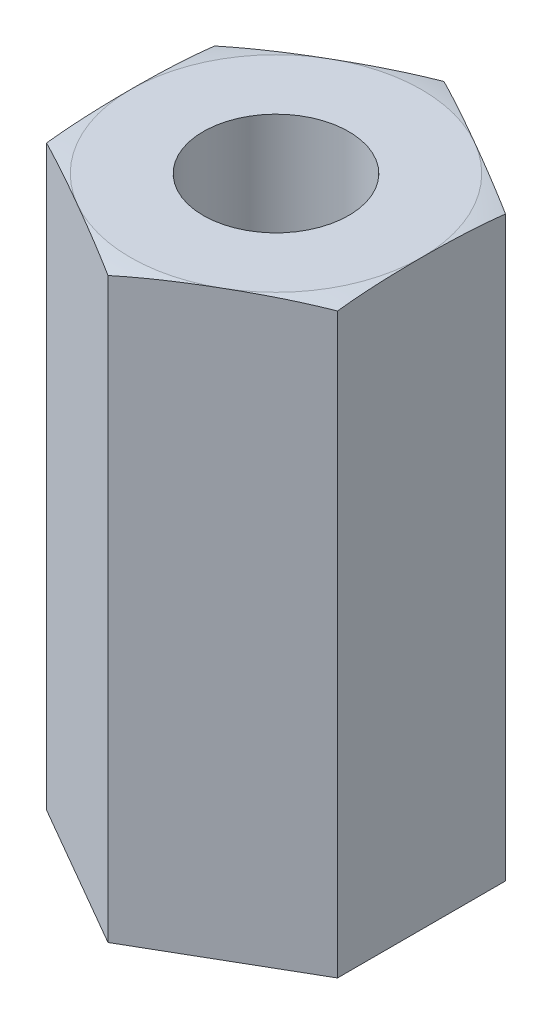
ISO-10303-21;
HEADER;
FILE_DESCRIPTION(('STEP AP214'),'2;1');
FILE_NAME('part.step','',(''),(''),'','','');
FILE_SCHEMA(('AUTOMOTIVE_DESIGN { 1 0 10303 214 1 1 1 1 }'));
ENDSEC;
DATA;
#1=APPLICATION_CONTEXT('core data for automotive mechanical design processes');
#2=APPLICATION_PROTOCOL_DEFINITION('international standard','automotive_design',2000,#1);
#3=PRODUCT_CONTEXT('',#1,'mechanical');
#4=PRODUCT('Part','Part','',(#3));
#5=PRODUCT_RELATED_PRODUCT_CATEGORY('part','',(#4));
#6=PRODUCT_DEFINITION_FORMATION('','',#4);
#7=PRODUCT_DEFINITION_CONTEXT('part definition',#1,'design');
#8=PRODUCT_DEFINITION('design','',#6,#7);
#9=PRODUCT_DEFINITION_SHAPE('','',#8);
#10=(LENGTH_UNIT() NAMED_UNIT(*) SI_UNIT(.MILLI.,.METRE.));
#11=(NAMED_UNIT(*) PLANE_ANGLE_UNIT() SI_UNIT($,.RADIAN.));
#12=(NAMED_UNIT(*) SI_UNIT($,.STERADIAN.) SOLID_ANGLE_UNIT());
#13=UNCERTAINTY_MEASURE_WITH_UNIT(LENGTH_MEASURE(1.E-05),#10,'distance_accuracy_value','');
#14=(GEOMETRIC_REPRESENTATION_CONTEXT(3) GLOBAL_UNCERTAINTY_ASSIGNED_CONTEXT((#13)) GLOBAL_UNIT_ASSIGNED_CONTEXT((#10,
#11,#12)) REPRESENTATION_CONTEXT('',''));
#15=CARTESIAN_POINT('',(0.,0.,0.));
#16=DIRECTION('',(0.,0.,1.));
#17=DIRECTION('',(1.,0.,0.));
#18=AXIS2_PLACEMENT_3D('',#15,#16,#17);
#19=CARTESIAN_POINT('',(0.,-4.45267771783658,0.));
#20=DIRECTION('',(0.,1.,0.));
#21=DIRECTION('',(0.,0.,1.));
#22=AXIS2_PLACEMENT_3D('',#19,#20,#21);
#23=DEGENERATE_TOROIDAL_SURFACE('',#22,1.8491074273878,4.5,.T.);
#24=CARTESIAN_POINT('',(0.,0.,0.));
#25=DIRECTION('',(0.,1.,0.));
#26=DIRECTION('',(0.,0.,1.));
#27=AXIS2_PLACEMENT_3D('',#24,#25,#26);
#28=CIRCLE('',#27,2.5);
#29=CARTESIAN_POINT('',(1.25000000000002,0.,2.16506350946108));
#30=VERTEX_POINT('',#29);
#31=CARTESIAN_POINT('',(2.5,0.,0.));
#32=VERTEX_POINT('',#31);
#33=EDGE_CURVE('E329',#30,#32,#28,.T.);
#34=ORIENTED_EDGE('',*,*,#33,.F.);
#35=CARTESIAN_POINT('',(2.50000000000002,-0.07394558418416,1.44337567297404));
#36=CARTESIAN_POINT('',(1.95952836675521,0.,1.75541711591729));
#37=CARTESIAN_POINT('',(1.25000000000002,0.,2.16506350946108));
#38=B_SPLINE_CURVE_WITH_KNOTS('',2,(#35,#36,#37),.UNSPECIFIED.,.F.,.F.,(3,3),(0.,1.),.UNSPECIFIED.);
#39=CARTESIAN_POINT('',(2.5,-0.0739455841841647,1.44337567297404));
#40=VERTEX_POINT('',#39);
#41=EDGE_CURVE('E245',#40,#30,#38,.T.);
#42=ORIENTED_EDGE('',*,*,#41,.F.);
#43=CARTESIAN_POINT('',(2.49999999999998,0.,0.));
#44=CARTESIAN_POINT('',(2.49999999999999,0.,0.819292787073817));
#45=CARTESIAN_POINT('',(2.5,-0.07394558418416,1.44337567297404));
#46=B_SPLINE_CURVE_WITH_KNOTS('',2,(#43,#44,#45),.UNSPECIFIED.,.F.,.F.,(3,3),(0.,1.),.UNSPECIFIED.);
#47=EDGE_CURVE('E260',#32,#40,#46,.T.);
#48=ORIENTED_EDGE('',*,*,#47,.F.);
#49=EDGE_LOOP('',(#34,#42,#48));
#50=FACE_BOUND('',#49,.T.);
#51=ADVANCED_FACE('F25',(#50),#23,.T.);
#52=CARTESIAN_POINT('',(0.,-4.45267771783658,0.));
#53=DIRECTION('',(0.,1.,0.));
#54=DIRECTION('',(0.,0.,1.));
#55=AXIS2_PLACEMENT_3D('',#52,#53,#54);
#56=DEGENERATE_TOROIDAL_SURFACE('',#55,1.8491074273878,4.5,.T.);
#57=CARTESIAN_POINT('',(1.25,0.,-2.16506350946112));
#58=CARTESIAN_POINT('',(1.95952836673887,0.,-1.75541711592676));
#59=CARTESIAN_POINT('',(2.49999999997253,-0.0739455841810201,-1.44337567298995));
#60=B_SPLINE_CURVE_WITH_KNOTS('',2,(#57,#58,#59),.UNSPECIFIED.,.F.,.F.,(3,3),(0.,1.),.UNSPECIFIED.);
#61=CARTESIAN_POINT('',(1.24999999999998,0.,-2.1650635094611));
#62=VERTEX_POINT('',#61);
#63=CARTESIAN_POINT('',(2.49999999997251,-0.0739455841810228,-1.44337567298995));
#64=VERTEX_POINT('',#63);
#65=EDGE_CURVE('E386',#62,#64,#60,.T.);
#66=ORIENTED_EDGE('',*,*,#65,.F.);
#67=CARTESIAN_POINT('',(0.,0.,0.));
#68=DIRECTION('',(0.,1.,0.));
#69=DIRECTION('',(0.,0.,1.));
#70=AXIS2_PLACEMENT_3D('',#67,#68,#69);
#71=CIRCLE('',#70,2.49999999999996);
#72=EDGE_CURVE('E177',#32,#62,#71,.T.);
#73=ORIENTED_EDGE('',*,*,#72,.F.);
#74=CARTESIAN_POINT('',(2.49999999999997,-0.0739455841810201,-1.44337567298995));
#75=CARTESIAN_POINT('',(2.49999999999998,0.,-0.819292787015203));
#76=CARTESIAN_POINT('',(2.49999999999998,0.,0.));
#77=B_SPLINE_CURVE_WITH_KNOTS('',2,(#74,#75,#76),.UNSPECIFIED.,.F.,.F.,(3,3),(0.,1.),.UNSPECIFIED.);
#78=EDGE_CURVE('E133',#64,#32,#77,.T.);
#79=ORIENTED_EDGE('',*,*,#78,.F.);
#80=EDGE_LOOP('',(#66,#73,#79));
#81=FACE_BOUND('',#80,.T.);
#82=ADVANCED_FACE('F209',(#81),#56,.T.);
#83=CARTESIAN_POINT('',(0.,-4.45267771783658,0.));
#84=DIRECTION('',(0.,1.,0.));
#85=DIRECTION('',(0.,0.,1.));
#86=AXIS2_PLACEMENT_3D('',#83,#84,#85);
#87=DEGENERATE_TOROIDAL_SURFACE('',#86,1.8491074273878,4.5,.T.);
#88=CARTESIAN_POINT('',(-1.25,0.,-2.1650635094611));
#89=CARTESIAN_POINT('',(-0.540471633244815,0.,-2.57470990300488));
#90=CARTESIAN_POINT('',(0.,-0.0739455841841635,-2.88675134594813));
#91=B_SPLINE_CURVE_WITH_KNOTS('',2,(#88,#89,#90),.UNSPECIFIED.,.F.,.F.,(3,3),(0.,1.),.UNSPECIFIED.);
#92=CARTESIAN_POINT('',(-1.25,0.,-2.1650635094611));
#93=VERTEX_POINT('',#92);
#94=CARTESIAN_POINT('',(0.,-0.0739455841841531,-2.88675134594813));
#95=VERTEX_POINT('',#94);
#96=EDGE_CURVE('E155',#93,#95,#91,.T.);
#97=ORIENTED_EDGE('',*,*,#96,.F.);
#98=CARTESIAN_POINT('',(0.,0.,0.));
#99=DIRECTION('',(0.,1.,0.));
#100=DIRECTION('',(0.,0.,1.));
#101=AXIS2_PLACEMENT_3D('',#98,#99,#100);
#102=CIRCLE('',#101,2.49999999999996);
#103=EDGE_CURVE('E144',#62,#93,#102,.T.);
#104=ORIENTED_EDGE('',*,*,#103,.F.);
#105=CARTESIAN_POINT('',(0.,-0.0739455841841513,-2.88675134594815));
#106=CARTESIAN_POINT('',(0.54047163324484,0.,-2.57470990300489));
#107=CARTESIAN_POINT('',(1.25,0.,-2.16506350946112));
#108=B_SPLINE_CURVE_WITH_KNOTS('',2,(#105,#106,#107),.UNSPECIFIED.,.F.,.F.,(3,3),(0.,1.),.UNSPECIFIED.);
#109=EDGE_CURVE('E183',#95,#62,#108,.T.);
#110=ORIENTED_EDGE('',*,*,#109,.F.);
#111=EDGE_LOOP('',(#97,#104,#110));
#112=FACE_BOUND('',#111,.T.);
#113=ADVANCED_FACE('F181',(#112),#87,.T.);
#114=CARTESIAN_POINT('',(0.,-4.45267771783658,0.));
#115=DIRECTION('',(0.,1.,0.));
#116=DIRECTION('',(0.,0.,1.));
#117=AXIS2_PLACEMENT_3D('',#114,#115,#116);
#118=DEGENERATE_TOROIDAL_SURFACE('',#117,1.8491074273878,4.5,.T.);
#119=CARTESIAN_POINT('',(0.,0.,0.));
#120=DIRECTION('',(0.,1.,0.));
#121=DIRECTION('',(0.,0.,1.));
#122=AXIS2_PLACEMENT_3D('',#119,#120,#121);
#123=CIRCLE('',#122,2.49999999999996);
#124=CARTESIAN_POINT('',(-2.5,0.,0.));
#125=VERTEX_POINT('',#124);
#126=EDGE_CURVE('E162',#93,#125,#123,.T.);
#127=ORIENTED_EDGE('',*,*,#126,.F.);
#128=CARTESIAN_POINT('',(-2.50000000002462,-0.0739455841881637,-1.44337567295985));
#129=CARTESIAN_POINT('',(-1.95952836677233,0.,-1.75541711590742));
#130=CARTESIAN_POINT('',(-1.25,0.,-2.1650635094611));
#131=B_SPLINE_CURVE_WITH_KNOTS('',2,(#128,#129,#130),.UNSPECIFIED.,.F.,.F.,(3,3),(0.,1.),.UNSPECIFIED.);
#132=CARTESIAN_POINT('',(-2.50000000002462,-0.0739455841881482,-1.44337567295985));
#133=VERTEX_POINT('',#132);
#134=EDGE_CURVE('E164',#133,#93,#131,.T.);
#135=ORIENTED_EDGE('',*,*,#134,.F.);
#136=CARTESIAN_POINT('',(-2.49999999999999,0.,0.));
#137=CARTESIAN_POINT('',(-2.5,0.,-0.819292787142444));
#138=CARTESIAN_POINT('',(-2.5,-0.0739455841881516,-1.44337567295985));
#139=B_SPLINE_CURVE_WITH_KNOTS('',2,(#136,#137,#138),.UNSPECIFIED.,.F.,.F.,(3,3),(0.,1.),.UNSPECIFIED.);
#140=EDGE_CURVE('E168',#125,#133,#139,.T.);
#141=ORIENTED_EDGE('',*,*,#140,.F.);
#142=EDGE_LOOP('',(#127,#135,#141));
#143=FACE_BOUND('',#142,.T.);
#144=ADVANCED_FACE('F163',(#143),#118,.T.);
#145=CARTESIAN_POINT('',(0.,-4.45267771783658,0.));
#146=DIRECTION('',(0.,1.,0.));
#147=DIRECTION('',(0.,0.,1.));
#148=AXIS2_PLACEMENT_3D('',#145,#146,#147);
#149=DEGENERATE_TOROIDAL_SURFACE('',#148,1.8491074273878,4.5,.T.);
#150=CARTESIAN_POINT('',(0.,0.,0.));
#151=DIRECTION('',(0.,1.,0.));
#152=DIRECTION('',(0.,0.,1.));
#153=AXIS2_PLACEMENT_3D('',#150,#151,#152);
#154=CIRCLE('',#153,2.49999999999996);
#155=CARTESIAN_POINT('',(-1.25,0.,2.1650635094611));
#156=VERTEX_POINT('',#155);
#157=EDGE_CURVE('E95',#125,#156,#154,.T.);
#158=ORIENTED_EDGE('',*,*,#157,.F.);
#159=CARTESIAN_POINT('',(-2.49999999999999,-0.0739455841858305,1.44337567298284));
#160=CARTESIAN_POINT('',(-2.49999999999999,0.,0.81929278708802));
#161=CARTESIAN_POINT('',(-2.49999999999999,0.,0.));
#162=B_SPLINE_CURVE_WITH_KNOTS('',2,(#159,#160,#161),.UNSPECIFIED.,.F.,.F.,(3,3),(0.,1.),.UNSPECIFIED.);
#163=CARTESIAN_POINT('',(-2.5,-0.0739455841858261,1.44337567298284));
#164=VERTEX_POINT('',#163);
#165=EDGE_CURVE('E227',#164,#125,#162,.T.);
#166=ORIENTED_EDGE('',*,*,#165,.F.);
#167=CARTESIAN_POINT('',(-1.25,0.,2.16506350946111));
#168=CARTESIAN_POINT('',(-1.95952836675749,0.,1.75541711591599));
#169=CARTESIAN_POINT('',(-2.49999999999621,-0.0739455841858305,1.44337567297627));
#170=B_SPLINE_CURVE_WITH_KNOTS('',2,(#167,#168,#169),.UNSPECIFIED.,.F.,.F.,(3,3),(0.,1.),.UNSPECIFIED.);
#171=EDGE_CURVE('E363',#156,#164,#170,.T.);
#172=ORIENTED_EDGE('',*,*,#171,.F.);
#173=EDGE_LOOP('',(#158,#166,#172));
#174=FACE_BOUND('',#173,.T.);
#175=ADVANCED_FACE('F303',(#174),#149,.T.);
#176=CARTESIAN_POINT('',(0.,-4.45267771783658,0.));
#177=DIRECTION('',(0.,1.,0.));
#178=DIRECTION('',(0.,0.,1.));
#179=AXIS2_PLACEMENT_3D('',#176,#177,#178);
#180=DEGENERATE_TOROIDAL_SURFACE('',#179,1.8491074273878,4.5,.T.);
#181=CARTESIAN_POINT('',(0.,0.,0.));
#182=DIRECTION('',(0.,1.,0.));
#183=DIRECTION('',(0.,0.,1.));
#184=AXIS2_PLACEMENT_3D('',#181,#182,#183);
#185=CIRCLE('',#184,2.49999999999996);
#186=EDGE_CURVE('E223',#156,#30,#185,.T.);
#187=ORIENTED_EDGE('',*,*,#186,.F.);
#188=CARTESIAN_POINT('',(1.92072920068842E-11,-0.0739455841874213,2.88675134595923));
#189=CARTESIAN_POINT('',(-0.540471633231137,0.,2.57470990301278));
#190=CARTESIAN_POINT('',(-1.25,0.,2.16506350946111));
#191=B_SPLINE_CURVE_WITH_KNOTS('',2,(#188,#189,#190),.UNSPECIFIED.,.F.,.F.,(3,3),(0.,1.),.UNSPECIFIED.);
#192=CARTESIAN_POINT('',(1.9214441125812E-11,-0.0739455841874185,2.88675134595921));
#193=VERTEX_POINT('',#192);
#194=EDGE_CURVE('E239',#193,#156,#191,.T.);
#195=ORIENTED_EDGE('',*,*,#194,.F.);
#196=CARTESIAN_POINT('',(1.25000000000002,0.,2.16506350946108));
#197=CARTESIAN_POINT('',(0.540471633241091,0.,2.57470990300704));
#198=CARTESIAN_POINT('',(9.61781355813701E-12,-0.0739455841874213,2.88675134594259));
#199=B_SPLINE_CURVE_WITH_KNOTS('',2,(#196,#197,#198),.UNSPECIFIED.,.F.,.F.,(3,3),(0.,1.),.UNSPECIFIED.);
#200=EDGE_CURVE('E257',#30,#193,#199,.T.);
#201=ORIENTED_EDGE('',*,*,#200,.F.);
#202=EDGE_LOOP('',(#187,#195,#201));
#203=FACE_BOUND('',#202,.T.);
#204=ADVANCED_FACE('F307',(#203),#180,.T.);
#205=CARTESIAN_POINT('',(0.,0.,0.));
#206=DIRECTION('',(0.,1.,0.));
#207=DIRECTION('',(0.,0.,1.));
#208=AXIS2_PLACEMENT_3D('',#205,#206,#207);
#209=CYLINDRICAL_SURFACE('',#208,1.25);
#210=CARTESIAN_POINT('',(0.,-10.,0.));
#211=DIRECTION('',(0.,1.,0.));
#212=DIRECTION('',(0.,0.,1.));
#213=AXIS2_PLACEMENT_3D('',#210,#211,#212);
#214=CIRCLE('',#213,1.25);
#215=CARTESIAN_POINT('',(0.,-10.,1.25));
#216=VERTEX_POINT('',#215);
#217=EDGE_CURVE('E13',#216,#216,#214,.T.);
#218=ORIENTED_EDGE('',*,*,#217,.F.);
#219=EDGE_LOOP('',(#218));
#220=FACE_BOUND('',#219,.T.);
#221=CARTESIAN_POINT('',(0.,0.,0.));
#222=DIRECTION('',(0.,1.,0.));
#223=DIRECTION('',(0.,0.,1.));
#224=AXIS2_PLACEMENT_3D('',#221,#222,#223);
#225=CIRCLE('',#224,1.25);
#226=CARTESIAN_POINT('',(0.,0.,1.25));
#227=VERTEX_POINT('',#226);
#228=EDGE_CURVE('E39',#227,#227,#225,.T.);
#229=ORIENTED_EDGE('',*,*,#228,.T.);
#230=EDGE_LOOP('',(#229));
#231=FACE_BOUND('',#230,.T.);
#232=ADVANCED_FACE('F301',(#220,#231),#209,.F.);
#233=CARTESIAN_POINT('',(0.,-10.,0.));
#234=DIRECTION('',(0.,1.,0.));
#235=DIRECTION('',(1.,0.,0.));
#236=AXIS2_PLACEMENT_3D('',#233,#234,#235);
#237=PLANE('',#236);
#238=ORIENTED_EDGE('',*,*,#217,.T.);
#239=EDGE_LOOP('',(#238));
#240=FACE_BOUND('',#239,.T.);
#241=DIRECTION('',(-0.866025403784442,0.,-0.5));
#242=VECTOR('',#241,1.);
#243=CARTESIAN_POINT('',(2.5,-10.,-1.44337567297409));
#244=LINE('',#243,#242);
#245=CARTESIAN_POINT('',(2.5,-10.,-1.44337567297409));
#246=VERTEX_POINT('',#245);
#247=CARTESIAN_POINT('',(0.,-10.,-2.88675134594813));
#248=VERTEX_POINT('',#247);
#249=EDGE_CURVE('E229',#246,#248,#244,.T.);
#250=ORIENTED_EDGE('',*,*,#249,.F.);
#251=DIRECTION('',(0.,0.,-1.));
#252=VECTOR('',#251,1.);
#253=CARTESIAN_POINT('',(2.5,-10.,1.44337567297404));
#254=LINE('',#253,#252);
#255=CARTESIAN_POINT('',(2.5,-10.,1.44337567297404));
#256=VERTEX_POINT('',#255);
#257=EDGE_CURVE('E243',#256,#246,#254,.T.);
#258=ORIENTED_EDGE('',*,*,#257,.F.);
#259=DIRECTION('',(0.866025403784435,0.,-0.500000000000007));
#260=VECTOR('',#259,1.);
#261=CARTESIAN_POINT('',(0.,-10.,2.88675134594813));
#262=LINE('',#261,#260);
#263=CARTESIAN_POINT('',(0.,-10.,2.88675134594813));
#264=VERTEX_POINT('',#263);
#265=EDGE_CURVE('E236',#264,#256,#262,.T.);
#266=ORIENTED_EDGE('',*,*,#265,.F.);
#267=DIRECTION('',(0.866025403784442,0.,0.5));
#268=VECTOR('',#267,1.);
#269=CARTESIAN_POINT('',(-2.5,-10.,1.44337567297408));
#270=LINE('',#269,#268);
#271=CARTESIAN_POINT('',(-2.5,-10.,1.44337567297408));
#272=VERTEX_POINT('',#271);
#273=EDGE_CURVE('E224',#272,#264,#270,.T.);
#274=ORIENTED_EDGE('',*,*,#273,.F.);
#275=DIRECTION('',(0.,0.,1.));
#276=VECTOR('',#275,1.);
#277=CARTESIAN_POINT('',(-2.5,-10.,-1.44337567297406));
#278=LINE('',#277,#276);
#279=CARTESIAN_POINT('',(-2.5,-10.,-1.44337567297406));
#280=VERTEX_POINT('',#279);
#281=EDGE_CURVE('E112',#280,#272,#278,.T.);
#282=ORIENTED_EDGE('',*,*,#281,.F.);
#283=DIRECTION('',(-0.866025403784438,0.,0.5));
#284=VECTOR('',#283,1.);
#285=CARTESIAN_POINT('',(0.,-10.,-2.88675134594813));
#286=LINE('',#285,#284);
#287=EDGE_CURVE('E186',#248,#280,#286,.T.);
#288=ORIENTED_EDGE('',*,*,#287,.F.);
#289=EDGE_LOOP('',(#250,#258,#266,#274,#282,#288));
#290=FACE_BOUND('',#289,.T.);
#291=ADVANCED_FACE('F448',(#240,#290),#237,.F.);
#292=CARTESIAN_POINT('',(0.,0.,0.));
#293=DIRECTION('',(0.,1.,0.));
#294=DIRECTION('',(1.,0.,0.));
#295=AXIS2_PLACEMENT_3D('',#292,#293,#294);
#296=PLANE('',#295);
#297=ORIENTED_EDGE('',*,*,#228,.F.);
#298=EDGE_LOOP('',(#297));
#299=FACE_BOUND('',#298,.T.);
#300=ORIENTED_EDGE('',*,*,#186,.T.);
#301=ORIENTED_EDGE('',*,*,#33,.T.);
#302=ORIENTED_EDGE('',*,*,#72,.T.);
#303=ORIENTED_EDGE('',*,*,#103,.T.);
#304=ORIENTED_EDGE('',*,*,#126,.T.);
#305=ORIENTED_EDGE('',*,*,#157,.T.);
#306=EDGE_LOOP('',(#300,#301,#302,#303,#304,#305));
#307=FACE_BOUND('',#306,.T.);
#308=ADVANCED_FACE('F175',(#299,#307),#296,.T.);
#309=CARTESIAN_POINT('',(0.,-10.,-2.88675134594813));
#310=DIRECTION('',(-0.5,0.,-0.866025403784438));
#311=DIRECTION('',(-0.866025403784438,0.,0.5));
#312=AXIS2_PLACEMENT_3D('',#309,#310,#311);
#313=PLANE('',#312);
#314=DIRECTION('',(0.,1.,0.));
#315=VECTOR('',#314,1.);
#316=CARTESIAN_POINT('',(-2.5,-10.,-1.44337567297406));
#317=LINE('',#316,#315);
#318=EDGE_CURVE('E191',#280,#133,#317,.T.);
#319=ORIENTED_EDGE('',*,*,#318,.T.);
#320=ORIENTED_EDGE('',*,*,#134,.T.);
#321=ORIENTED_EDGE('',*,*,#96,.T.);
#322=DIRECTION('',(0.,1.,0.));
#323=VECTOR('',#322,1.);
#324=CARTESIAN_POINT('',(0.,-10.,-2.88675134594813));
#325=LINE('',#324,#323);
#326=EDGE_CURVE('E423',#248,#95,#325,.T.);
#327=ORIENTED_EDGE('',*,*,#326,.F.);
#328=ORIENTED_EDGE('',*,*,#287,.T.);
#329=EDGE_LOOP('',(#319,#320,#321,#327,#328));
#330=FACE_BOUND('',#329,.T.);
#331=ADVANCED_FACE('F190',(#330),#313,.T.);
#332=CARTESIAN_POINT('',(-2.5,-10.,-1.44337567297406));
#333=DIRECTION('',(-1.,0.,0.));
#334=DIRECTION('',(0.,1.,0.));
#335=AXIS2_PLACEMENT_3D('',#332,#333,#334);
#336=PLANE('',#335);
#337=ORIENTED_EDGE('',*,*,#165,.T.);
#338=ORIENTED_EDGE('',*,*,#140,.T.);
#339=ORIENTED_EDGE('',*,*,#318,.F.);
#340=ORIENTED_EDGE('',*,*,#281,.T.);
#341=DIRECTION('',(0.,1.,0.));
#342=VECTOR('',#341,1.);
#343=CARTESIAN_POINT('',(-2.5,-10.,1.44337567297408));
#344=LINE('',#343,#342);
#345=EDGE_CURVE('E228',#272,#164,#344,.T.);
#346=ORIENTED_EDGE('',*,*,#345,.T.);
#347=EDGE_LOOP('',(#337,#338,#339,#340,#346));
#348=FACE_BOUND('',#347,.T.);
#349=ADVANCED_FACE('F208',(#348),#336,.T.);
#350=CARTESIAN_POINT('',(-2.5,-10.,1.44337567297408));
#351=DIRECTION('',(-0.5,0.,0.866025403784441));
#352=DIRECTION('',(0.,1.,0.));
#353=AXIS2_PLACEMENT_3D('',#350,#351,#352);
#354=PLANE('',#353);
#355=DIRECTION('',(0.,1.,0.));
#356=VECTOR('',#355,1.);
#357=CARTESIAN_POINT('',(0.,-10.,2.88675134594813));
#358=LINE('',#357,#356);
#359=EDGE_CURVE('E240',#264,#193,#358,.T.);
#360=ORIENTED_EDGE('',*,*,#359,.T.);
#361=ORIENTED_EDGE('',*,*,#194,.T.);
#362=ORIENTED_EDGE('',*,*,#171,.T.);
#363=ORIENTED_EDGE('',*,*,#345,.F.);
#364=ORIENTED_EDGE('',*,*,#273,.T.);
#365=EDGE_LOOP('',(#360,#361,#362,#363,#364));
#366=FACE_BOUND('',#365,.T.);
#367=ADVANCED_FACE('F342',(#366),#354,.T.);
#368=CARTESIAN_POINT('',(0.,-10.,2.88675134594813));
#369=DIRECTION('',(0.500000000000007,0.,0.866025403784435));
#370=DIRECTION('',(0.,-1.,0.));
#371=AXIS2_PLACEMENT_3D('',#368,#369,#370);
#372=PLANE('',#371);
#373=DIRECTION('',(0.,1.,0.));
#374=VECTOR('',#373,1.);
#375=CARTESIAN_POINT('',(2.5,-10.,1.44337567297404));
#376=LINE('',#375,#374);
#377=EDGE_CURVE('E246',#256,#40,#376,.T.);
#378=ORIENTED_EDGE('',*,*,#377,.T.);
#379=ORIENTED_EDGE('',*,*,#41,.T.);
#380=ORIENTED_EDGE('',*,*,#200,.T.);
#381=ORIENTED_EDGE('',*,*,#359,.F.);
#382=ORIENTED_EDGE('',*,*,#265,.T.);
#383=EDGE_LOOP('',(#378,#379,#380,#381,#382));
#384=FACE_BOUND('',#383,.T.);
#385=ADVANCED_FACE('F350',(#384),#372,.T.);
#386=CARTESIAN_POINT('',(2.5,-10.,1.44337567297404));
#387=DIRECTION('',(1.,0.,0.));
#388=DIRECTION('',(0.,0.,-1.));
#389=AXIS2_PLACEMENT_3D('',#386,#387,#388);
#390=PLANE('',#389);
#391=ORIENTED_EDGE('',*,*,#78,.T.);
#392=ORIENTED_EDGE('',*,*,#47,.T.);
#393=ORIENTED_EDGE('',*,*,#377,.F.);
#394=ORIENTED_EDGE('',*,*,#257,.T.);
#395=DIRECTION('',(0.,1.,0.));
#396=VECTOR('',#395,1.);
#397=CARTESIAN_POINT('',(2.5,-10.,-1.44337567297409));
#398=LINE('',#397,#396);
#399=EDGE_CURVE('E233',#246,#64,#398,.T.);
#400=ORIENTED_EDGE('',*,*,#399,.T.);
#401=EDGE_LOOP('',(#391,#392,#393,#394,#400));
#402=FACE_BOUND('',#401,.T.);
#403=ADVANCED_FACE('F27',(#402),#390,.T.);
#404=CARTESIAN_POINT('',(2.5,-10.,-1.44337567297409));
#405=DIRECTION('',(0.5,0.,-0.866025403784442));
#406=DIRECTION('',(0.,-1.,0.));
#407=AXIS2_PLACEMENT_3D('',#404,#405,#406);
#408=PLANE('',#407);
#409=ORIENTED_EDGE('',*,*,#326,.T.);
#410=ORIENTED_EDGE('',*,*,#109,.T.);
#411=ORIENTED_EDGE('',*,*,#65,.T.);
#412=ORIENTED_EDGE('',*,*,#399,.F.);
#413=ORIENTED_EDGE('',*,*,#249,.T.);
#414=EDGE_LOOP('',(#409,#410,#411,#412,#413));
#415=FACE_BOUND('',#414,.T.);
#416=ADVANCED_FACE('F501',(#415),#408,.T.);
#417=CLOSED_SHELL('',(#51,#82,#113,#144,#175,#204,#232,#291,#308,#331,#349,#367,#385,#403,#416));
#418=MANIFOLD_SOLID_BREP('B1',#417);
#419=ADVANCED_BREP_SHAPE_REPRESENTATION('',(#18,#418),#14);
#420=SHAPE_DEFINITION_REPRESENTATION(#9,#419);
ENDSEC;
END-ISO-10303-21;
